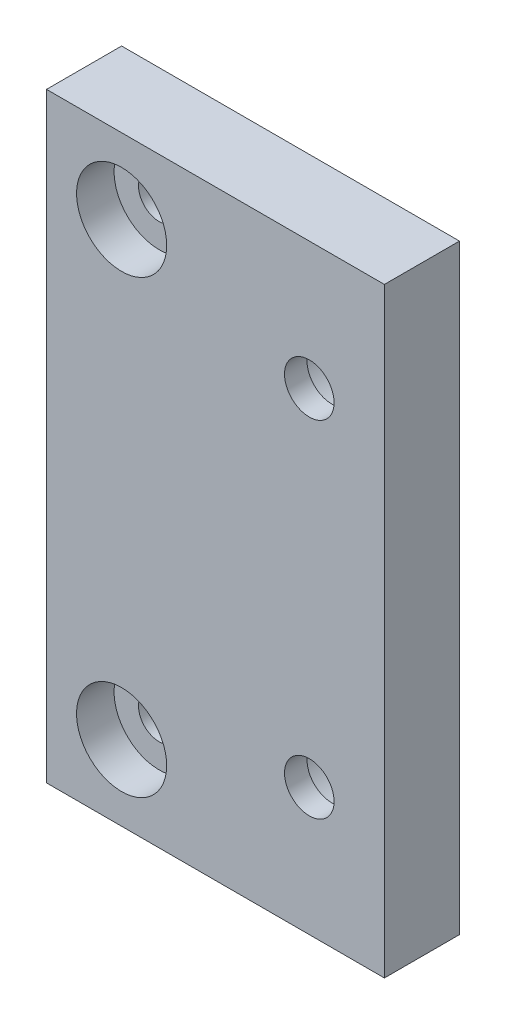
ISO-10303-21;
HEADER;
FILE_DESCRIPTION(('STEP AP214'),'2;1');
FILE_NAME('part.step','',(''),(''),'','','');
FILE_SCHEMA(('AUTOMOTIVE_DESIGN { 1 0 10303 214 1 1 1 1 }'));
ENDSEC;
DATA;
#1=APPLICATION_CONTEXT('core data for automotive mechanical design processes');
#2=APPLICATION_PROTOCOL_DEFINITION('international standard','automotive_design',2000,#1);
#3=PRODUCT_CONTEXT('',#1,'mechanical');
#4=PRODUCT('Part','Part','',(#3));
#5=PRODUCT_RELATED_PRODUCT_CATEGORY('part','',(#4));
#6=PRODUCT_DEFINITION_FORMATION('','',#4);
#7=PRODUCT_DEFINITION_CONTEXT('part definition',#1,'design');
#8=PRODUCT_DEFINITION('design','',#6,#7);
#9=PRODUCT_DEFINITION_SHAPE('','',#8);
#10=(LENGTH_UNIT() NAMED_UNIT(*) SI_UNIT(.MILLI.,.METRE.));
#11=(NAMED_UNIT(*) PLANE_ANGLE_UNIT() SI_UNIT($,.RADIAN.));
#12=(NAMED_UNIT(*) SI_UNIT($,.STERADIAN.) SOLID_ANGLE_UNIT());
#13=UNCERTAINTY_MEASURE_WITH_UNIT(LENGTH_MEASURE(1.E-05),#10,'distance_accuracy_value','');
#14=(GEOMETRIC_REPRESENTATION_CONTEXT(3) GLOBAL_UNCERTAINTY_ASSIGNED_CONTEXT((#13)) GLOBAL_UNIT_ASSIGNED_CONTEXT((#10,
#11,#12)) REPRESENTATION_CONTEXT('',''));
#15=CARTESIAN_POINT('',(0.,0.,0.));
#16=DIRECTION('',(0.,0.,1.));
#17=DIRECTION('',(1.,0.,0.));
#18=AXIS2_PLACEMENT_3D('',#15,#16,#17);
#19=CARTESIAN_POINT('',(-1.17813610582342,24.1380472116371,10.));
#20=DIRECTION('',(0.,0.,-1.));
#21=DIRECTION('',(-1.,0.,0.));
#22=AXIS2_PLACEMENT_3D('',#19,#20,#21);
#23=CYLINDRICAL_SURFACE('',#22,3.3);
#24=CARTESIAN_POINT('',(-1.17813610582342,24.1380472116371,10.));
#25=DIRECTION('',(0.,0.,1.));
#26=DIRECTION('',(1.,0.,0.));
#27=AXIS2_PLACEMENT_3D('',#24,#25,#26);
#28=CIRCLE('',#27,3.3);
#29=CARTESIAN_POINT('',(2.12186389417658,24.1380472116371,10.));
#30=VERTEX_POINT('',#29);
#31=EDGE_CURVE('E118',#30,#30,#28,.T.);
#32=ORIENTED_EDGE('',*,*,#31,.T.);
#33=EDGE_LOOP('',(#32));
#34=FACE_BOUND('',#33,.T.);
#35=CARTESIAN_POINT('',(-1.17813610582342,24.1380472116371,7.));
#36=DIRECTION('',(0.,0.,-1.));
#37=DIRECTION('',(-1.,0.,0.));
#38=AXIS2_PLACEMENT_3D('',#35,#36,#37);
#39=CIRCLE('',#38,3.3);
#40=CARTESIAN_POINT('',(-4.47813610582342,24.1380472116371,7.));
#41=VERTEX_POINT('',#40);
#42=EDGE_CURVE('E45',#41,#41,#39,.T.);
#43=ORIENTED_EDGE('',*,*,#42,.T.);
#44=EDGE_LOOP('',(#43));
#45=FACE_BOUND('',#44,.T.);
#46=ADVANCED_FACE('F41',(#34,#45),#23,.F.);
#47=CARTESIAN_POINT('',(-1.17813610582342,-21.8619527883629,10.));
#48=DIRECTION('',(0.,0.,-1.));
#49=DIRECTION('',(-1.,0.,0.));
#50=AXIS2_PLACEMENT_3D('',#47,#48,#49);
#51=CYLINDRICAL_SURFACE('',#50,3.3);
#52=CARTESIAN_POINT('',(-1.17813610582342,-21.8619527883629,10.));
#53=DIRECTION('',(0.,0.,1.));
#54=DIRECTION('',(1.,0.,0.));
#55=AXIS2_PLACEMENT_3D('',#52,#53,#54);
#56=CIRCLE('',#55,3.3);
#57=CARTESIAN_POINT('',(2.12186389417658,-21.8619527883629,10.));
#58=VERTEX_POINT('',#57);
#59=EDGE_CURVE('E186',#58,#58,#56,.T.);
#60=ORIENTED_EDGE('',*,*,#59,.T.);
#61=EDGE_LOOP('',(#60));
#62=FACE_BOUND('',#61,.T.);
#63=CARTESIAN_POINT('',(-1.17813610582342,-21.8619527883629,7.));
#64=DIRECTION('',(0.,0.,-1.));
#65=DIRECTION('',(-1.,0.,0.));
#66=AXIS2_PLACEMENT_3D('',#63,#64,#65);
#67=CIRCLE('',#66,3.3);
#68=CARTESIAN_POINT('',(-4.47813610582342,-21.8619527883629,7.));
#69=VERTEX_POINT('',#68);
#70=EDGE_CURVE('E138',#69,#69,#67,.T.);
#71=ORIENTED_EDGE('',*,*,#70,.T.);
#72=EDGE_LOOP('',(#71));
#73=FACE_BOUND('',#72,.T.);
#74=ADVANCED_FACE('F215',(#62,#73),#51,.F.);
#75=CARTESIAN_POINT('',(-26.1781361058234,31.1380472116371,10.));
#76=DIRECTION('',(0.,0.,-1.));
#77=DIRECTION('',(-1.,0.,0.));
#78=AXIS2_PLACEMENT_3D('',#75,#76,#77);
#79=CYLINDRICAL_SURFACE('',#78,2.75);
#80=CARTESIAN_POINT('',(-26.1781361058234,31.1380472116371,0.));
#81=DIRECTION('',(0.,0.,1.));
#82=DIRECTION('',(1.,0.,0.));
#83=AXIS2_PLACEMENT_3D('',#80,#81,#82);
#84=CIRCLE('',#83,2.75);
#85=CARTESIAN_POINT('',(-23.4281361058234,31.1380472116371,0.));
#86=VERTEX_POINT('',#85);
#87=EDGE_CURVE('E182',#86,#86,#84,.T.);
#88=ORIENTED_EDGE('',*,*,#87,.F.);
#89=EDGE_LOOP('',(#88));
#90=FACE_BOUND('',#89,.T.);
#91=CARTESIAN_POINT('',(-26.1781361058234,31.1380472116371,5.));
#92=DIRECTION('',(0.,0.,1.));
#93=DIRECTION('',(1.,0.,0.));
#94=AXIS2_PLACEMENT_3D('',#91,#92,#93);
#95=CIRCLE('',#94,2.75);
#96=CARTESIAN_POINT('',(-23.4281361058234,31.1380472116371,5.));
#97=VERTEX_POINT('',#96);
#98=EDGE_CURVE('E133',#97,#97,#95,.T.);
#99=ORIENTED_EDGE('',*,*,#98,.T.);
#100=EDGE_LOOP('',(#99));
#101=FACE_BOUND('',#100,.T.);
#102=ADVANCED_FACE('F208',(#90,#101),#79,.F.);
#103=CARTESIAN_POINT('',(-26.1781361058234,-28.8619527883629,10.));
#104=DIRECTION('',(0.,0.,-1.));
#105=DIRECTION('',(-1.,0.,0.));
#106=AXIS2_PLACEMENT_3D('',#103,#104,#105);
#107=CYLINDRICAL_SURFACE('',#106,2.75);
#108=CARTESIAN_POINT('',(-26.1781361058234,-28.8619527883629,0.));
#109=DIRECTION('',(0.,0.,1.));
#110=DIRECTION('',(1.,0.,0.));
#111=AXIS2_PLACEMENT_3D('',#108,#109,#110);
#112=CIRCLE('',#111,2.75);
#113=CARTESIAN_POINT('',(-23.4281361058234,-28.8619527883629,0.));
#114=VERTEX_POINT('',#113);
#115=EDGE_CURVE('E137',#114,#114,#112,.T.);
#116=ORIENTED_EDGE('',*,*,#115,.F.);
#117=EDGE_LOOP('',(#116));
#118=FACE_BOUND('',#117,.T.);
#119=CARTESIAN_POINT('',(-26.1781361058234,-28.8619527883629,5.));
#120=DIRECTION('',(0.,0.,1.));
#121=DIRECTION('',(1.,0.,0.));
#122=AXIS2_PLACEMENT_3D('',#119,#120,#121);
#123=CIRCLE('',#122,2.75);
#124=CARTESIAN_POINT('',(-23.4281361058234,-28.8619527883629,5.));
#125=VERTEX_POINT('',#124);
#126=EDGE_CURVE('E129',#125,#125,#123,.T.);
#127=ORIENTED_EDGE('',*,*,#126,.T.);
#128=EDGE_LOOP('',(#127));
#129=FACE_BOUND('',#128,.T.);
#130=ADVANCED_FACE('F199',(#118,#129),#107,.F.);
#131=CARTESIAN_POINT('',(0.,0.,10.));
#132=DIRECTION('',(0.,0.,1.));
#133=DIRECTION('',(1.,0.,0.));
#134=AXIS2_PLACEMENT_3D('',#131,#132,#133);
#135=PLANE('',#134);
#136=CARTESIAN_POINT('',(-26.1781361058234,31.1380472116371,10.));
#137=DIRECTION('',(0.,0.,1.));
#138=DIRECTION('',(1.,0.,0.));
#139=AXIS2_PLACEMENT_3D('',#136,#137,#138);
#140=CIRCLE('',#139,6.);
#141=CARTESIAN_POINT('',(-20.1781361058234,31.1380472116371,10.));
#142=VERTEX_POINT('',#141);
#143=EDGE_CURVE('E168',#142,#142,#140,.T.);
#144=ORIENTED_EDGE('',*,*,#143,.F.);
#145=EDGE_LOOP('',(#144));
#146=FACE_BOUND('',#145,.T.);
#147=CARTESIAN_POINT('',(-26.1781361058234,-28.8619527883629,10.));
#148=DIRECTION('',(0.,0.,1.));
#149=DIRECTION('',(1.,0.,0.));
#150=AXIS2_PLACEMENT_3D('',#147,#148,#149);
#151=CIRCLE('',#150,6.);
#152=CARTESIAN_POINT('',(-20.1781361058234,-28.8619527883629,10.));
#153=VERTEX_POINT('',#152);
#154=EDGE_CURVE('E147',#153,#153,#151,.T.);
#155=ORIENTED_EDGE('',*,*,#154,.F.);
#156=EDGE_LOOP('',(#155));
#157=FACE_BOUND('',#156,.T.);
#158=ORIENTED_EDGE('',*,*,#31,.F.);
#159=EDGE_LOOP('',(#158));
#160=FACE_BOUND('',#159,.T.);
#161=DIRECTION('',(0.,-1.,0.));
#162=VECTOR('',#161,1.);
#163=CARTESIAN_POINT('',(-36.1781361058234,41.1380472116371,10.));
#164=LINE('',#163,#162);
#165=CARTESIAN_POINT('',(-36.1781361058234,41.1380472116371,10.));
#166=VERTEX_POINT('',#165);
#167=CARTESIAN_POINT('',(-36.1781361058234,-38.8619527883629,10.));
#168=VERTEX_POINT('',#167);
#169=EDGE_CURVE('E97',#166,#168,#164,.T.);
#170=ORIENTED_EDGE('',*,*,#169,.T.);
#171=DIRECTION('',(1.,0.,0.));
#172=VECTOR('',#171,1.);
#173=CARTESIAN_POINT('',(-36.1781361058234,-38.8619527883629,10.));
#174=LINE('',#173,#172);
#175=CARTESIAN_POINT('',(8.82186389417659,-38.8619527883629,10.));
#176=VERTEX_POINT('',#175);
#177=EDGE_CURVE('E91',#168,#176,#174,.T.);
#178=ORIENTED_EDGE('',*,*,#177,.T.);
#179=DIRECTION('',(0.,1.,0.));
#180=VECTOR('',#179,1.);
#181=CARTESIAN_POINT('',(8.82186389417659,41.1380472116371,10.));
#182=LINE('',#181,#180);
#183=CARTESIAN_POINT('',(8.82186389417659,41.1380472116371,10.));
#184=VERTEX_POINT('',#183);
#185=EDGE_CURVE('E95',#176,#184,#182,.T.);
#186=ORIENTED_EDGE('',*,*,#185,.T.);
#187=DIRECTION('',(-1.,0.,0.));
#188=VECTOR('',#187,1.);
#189=CARTESIAN_POINT('',(-36.1781361058234,41.1380472116371,10.));
#190=LINE('',#189,#188);
#191=EDGE_CURVE('E61',#184,#166,#190,.T.);
#192=ORIENTED_EDGE('',*,*,#191,.T.);
#193=EDGE_LOOP('',(#170,#178,#186,#192));
#194=FACE_BOUND('',#193,.T.);
#195=ORIENTED_EDGE('',*,*,#59,.F.);
#196=EDGE_LOOP('',(#195));
#197=FACE_BOUND('',#196,.T.);
#198=ADVANCED_FACE('F92',(#146,#157,#160,#194,#197),#135,.T.);
#199=CARTESIAN_POINT('',(0.,0.,0.));
#200=DIRECTION('',(0.,0.,1.));
#201=DIRECTION('',(1.,0.,0.));
#202=AXIS2_PLACEMENT_3D('',#199,#200,#201);
#203=PLANE('',#202);
#204=CARTESIAN_POINT('',(-1.17813610582342,24.1380472116371,0.));
#205=DIRECTION('',(0.,0.,-1.));
#206=DIRECTION('',(-1.,0.,0.));
#207=AXIS2_PLACEMENT_3D('',#204,#205,#206);
#208=CIRCLE('',#207,7.);
#209=CARTESIAN_POINT('',(-8.17813610582342,24.1380472116371,0.));
#210=VERTEX_POINT('',#209);
#211=EDGE_CURVE('E149',#210,#210,#208,.T.);
#212=ORIENTED_EDGE('',*,*,#211,.F.);
#213=EDGE_LOOP('',(#212));
#214=FACE_BOUND('',#213,.T.);
#215=CARTESIAN_POINT('',(-1.17813610582342,-21.8619527883629,0.));
#216=DIRECTION('',(0.,0.,-1.));
#217=DIRECTION('',(-1.,0.,0.));
#218=AXIS2_PLACEMENT_3D('',#215,#216,#217);
#219=CIRCLE('',#218,7.);
#220=CARTESIAN_POINT('',(-8.17813610582342,-21.8619527883629,0.));
#221=VERTEX_POINT('',#220);
#222=EDGE_CURVE('E161',#221,#221,#219,.T.);
#223=ORIENTED_EDGE('',*,*,#222,.F.);
#224=EDGE_LOOP('',(#223));
#225=FACE_BOUND('',#224,.T.);
#226=DIRECTION('',(0.,-1.,0.));
#227=VECTOR('',#226,1.);
#228=CARTESIAN_POINT('',(-36.1781361058234,41.1380472116371,0.));
#229=LINE('',#228,#227);
#230=CARTESIAN_POINT('',(-36.1781361058234,41.1380472116371,0.));
#231=VERTEX_POINT('',#230);
#232=CARTESIAN_POINT('',(-36.1781361058234,-38.8619527883629,0.));
#233=VERTEX_POINT('',#232);
#234=EDGE_CURVE('E114',#231,#233,#229,.T.);
#235=ORIENTED_EDGE('',*,*,#234,.F.);
#236=DIRECTION('',(-1.,0.,0.));
#237=VECTOR('',#236,1.);
#238=CARTESIAN_POINT('',(-36.1781361058234,41.1380472116371,0.));
#239=LINE('',#238,#237);
#240=CARTESIAN_POINT('',(8.82186389417659,41.1380472116371,0.));
#241=VERTEX_POINT('',#240);
#242=EDGE_CURVE('E84',#241,#231,#239,.T.);
#243=ORIENTED_EDGE('',*,*,#242,.F.);
#244=DIRECTION('',(0.,1.,0.));
#245=VECTOR('',#244,1.);
#246=CARTESIAN_POINT('',(8.82186389417659,41.1380472116371,0.));
#247=LINE('',#246,#245);
#248=CARTESIAN_POINT('',(8.82186389417659,-38.8619527883629,0.));
#249=VERTEX_POINT('',#248);
#250=EDGE_CURVE('E78',#249,#241,#247,.T.);
#251=ORIENTED_EDGE('',*,*,#250,.F.);
#252=DIRECTION('',(1.,0.,0.));
#253=VECTOR('',#252,1.);
#254=CARTESIAN_POINT('',(-36.1781361058234,-38.8619527883629,0.));
#255=LINE('',#254,#253);
#256=EDGE_CURVE('E102',#233,#249,#255,.T.);
#257=ORIENTED_EDGE('',*,*,#256,.F.);
#258=EDGE_LOOP('',(#235,#243,#251,#257));
#259=FACE_BOUND('',#258,.T.);
#260=ORIENTED_EDGE('',*,*,#87,.T.);
#261=EDGE_LOOP('',(#260));
#262=FACE_BOUND('',#261,.T.);
#263=ORIENTED_EDGE('',*,*,#115,.T.);
#264=EDGE_LOOP('',(#263));
#265=FACE_BOUND('',#264,.T.);
#266=ADVANCED_FACE('F198',(#214,#225,#259,#262,#265),#203,.F.);
#267=CARTESIAN_POINT('',(-36.1781361058234,41.1380472116371,10.));
#268=DIRECTION('',(1.,0.,0.));
#269=DIRECTION('',(0.,0.,-1.));
#270=AXIS2_PLACEMENT_3D('',#267,#268,#269);
#271=PLANE('',#270);
#272=ORIENTED_EDGE('',*,*,#234,.T.);
#273=DIRECTION('',(0.,0.,-1.));
#274=VECTOR('',#273,1.);
#275=CARTESIAN_POINT('',(-36.1781361058234,-38.8619527883629,10.));
#276=LINE('',#275,#274);
#277=EDGE_CURVE('E11',#168,#233,#276,.T.);
#278=ORIENTED_EDGE('',*,*,#277,.F.);
#279=ORIENTED_EDGE('',*,*,#169,.F.);
#280=DIRECTION('',(0.,0.,-1.));
#281=VECTOR('',#280,1.);
#282=CARTESIAN_POINT('',(-36.1781361058234,41.1380472116371,10.));
#283=LINE('',#282,#281);
#284=EDGE_CURVE('E110',#166,#231,#283,.T.);
#285=ORIENTED_EDGE('',*,*,#284,.T.);
#286=EDGE_LOOP('',(#272,#278,#279,#285));
#287=FACE_BOUND('',#286,.T.);
#288=ADVANCED_FACE('F43',(#287),#271,.F.);
#289=CARTESIAN_POINT('',(-36.1781361058234,-38.8619527883629,10.));
#290=DIRECTION('',(0.,1.,0.));
#291=DIRECTION('',(0.,0.,1.));
#292=AXIS2_PLACEMENT_3D('',#289,#290,#291);
#293=PLANE('',#292);
#294=ORIENTED_EDGE('',*,*,#256,.T.);
#295=DIRECTION('',(0.,0.,-1.));
#296=VECTOR('',#295,1.);
#297=CARTESIAN_POINT('',(8.82186389417659,-38.8619527883629,10.));
#298=LINE('',#297,#296);
#299=EDGE_CURVE('E52',#176,#249,#298,.T.);
#300=ORIENTED_EDGE('',*,*,#299,.F.);
#301=ORIENTED_EDGE('',*,*,#177,.F.);
#302=ORIENTED_EDGE('',*,*,#277,.T.);
#303=EDGE_LOOP('',(#294,#300,#301,#302));
#304=FACE_BOUND('',#303,.T.);
#305=ADVANCED_FACE('F101',(#304),#293,.F.);
#306=CARTESIAN_POINT('',(8.82186389417659,41.1380472116371,10.));
#307=DIRECTION('',(-1.,0.,0.));
#308=DIRECTION('',(0.,0.,1.));
#309=AXIS2_PLACEMENT_3D('',#306,#307,#308);
#310=PLANE('',#309);
#311=ORIENTED_EDGE('',*,*,#250,.T.);
#312=DIRECTION('',(0.,0.,-1.));
#313=VECTOR('',#312,1.);
#314=CARTESIAN_POINT('',(8.82186389417659,41.1380472116371,10.));
#315=LINE('',#314,#313);
#316=EDGE_CURVE('E104',#184,#241,#315,.T.);
#317=ORIENTED_EDGE('',*,*,#316,.F.);
#318=ORIENTED_EDGE('',*,*,#185,.F.);
#319=ORIENTED_EDGE('',*,*,#299,.T.);
#320=EDGE_LOOP('',(#311,#317,#318,#319));
#321=FACE_BOUND('',#320,.T.);
#322=ADVANCED_FACE('F106',(#321),#310,.F.);
#323=CARTESIAN_POINT('',(-36.1781361058234,41.1380472116371,10.));
#324=DIRECTION('',(0.,-1.,0.));
#325=DIRECTION('',(0.,0.,-1.));
#326=AXIS2_PLACEMENT_3D('',#323,#324,#325);
#327=PLANE('',#326);
#328=ORIENTED_EDGE('',*,*,#242,.T.);
#329=ORIENTED_EDGE('',*,*,#284,.F.);
#330=ORIENTED_EDGE('',*,*,#191,.F.);
#331=ORIENTED_EDGE('',*,*,#316,.T.);
#332=EDGE_LOOP('',(#328,#329,#330,#331));
#333=FACE_BOUND('',#332,.T.);
#334=ADVANCED_FACE('F229',(#333),#327,.F.);
#335=CARTESIAN_POINT('',(-26.1781361058234,-28.8619527883629,5.));
#336=DIRECTION('',(0.,0.,1.));
#337=DIRECTION('',(1.,0.,0.));
#338=AXIS2_PLACEMENT_3D('',#335,#336,#337);
#339=CYLINDRICAL_SURFACE('',#338,6.);
#340=CARTESIAN_POINT('',(-26.1781361058234,-28.8619527883629,5.));
#341=DIRECTION('',(0.,0.,1.));
#342=DIRECTION('',(1.,0.,0.));
#343=AXIS2_PLACEMENT_3D('',#340,#341,#342);
#344=CIRCLE('',#343,6.);
#345=CARTESIAN_POINT('',(-20.1781361058234,-28.8619527883629,5.));
#346=VERTEX_POINT('',#345);
#347=EDGE_CURVE('E172',#346,#346,#344,.T.);
#348=ORIENTED_EDGE('',*,*,#347,.F.);
#349=EDGE_LOOP('',(#348));
#350=FACE_BOUND('',#349,.T.);
#351=ORIENTED_EDGE('',*,*,#154,.T.);
#352=EDGE_LOOP('',(#351));
#353=FACE_BOUND('',#352,.T.);
#354=ADVANCED_FACE('F225',(#350,#353),#339,.F.);
#355=CARTESIAN_POINT('',(-26.1781361058234,-28.8619527883629,5.));
#356=DIRECTION('',(0.,0.,1.));
#357=DIRECTION('',(1.,0.,0.));
#358=AXIS2_PLACEMENT_3D('',#355,#356,#357);
#359=PLANE('',#358);
#360=ORIENTED_EDGE('',*,*,#126,.F.);
#361=EDGE_LOOP('',(#360));
#362=FACE_BOUND('',#361,.T.);
#363=ORIENTED_EDGE('',*,*,#347,.T.);
#364=EDGE_LOOP('',(#363));
#365=FACE_BOUND('',#364,.T.);
#366=ADVANCED_FACE('F228',(#362,#365),#359,.T.);
#367=CARTESIAN_POINT('',(-26.1781361058234,31.1380472116371,5.));
#368=DIRECTION('',(0.,0.,1.));
#369=DIRECTION('',(1.,0.,0.));
#370=AXIS2_PLACEMENT_3D('',#367,#368,#369);
#371=CYLINDRICAL_SURFACE('',#370,6.);
#372=CARTESIAN_POINT('',(-26.1781361058234,31.1380472116371,5.));
#373=DIRECTION('',(0.,0.,1.));
#374=DIRECTION('',(1.,0.,0.));
#375=AXIS2_PLACEMENT_3D('',#372,#373,#374);
#376=CIRCLE('',#375,6.);
#377=CARTESIAN_POINT('',(-20.1781361058234,31.1380472116371,5.));
#378=VERTEX_POINT('',#377);
#379=EDGE_CURVE('E134',#378,#378,#376,.T.);
#380=ORIENTED_EDGE('',*,*,#379,.F.);
#381=EDGE_LOOP('',(#380));
#382=FACE_BOUND('',#381,.T.);
#383=ORIENTED_EDGE('',*,*,#143,.T.);
#384=EDGE_LOOP('',(#383));
#385=FACE_BOUND('',#384,.T.);
#386=ADVANCED_FACE('F233',(#382,#385),#371,.F.);
#387=CARTESIAN_POINT('',(-26.1781361058234,31.1380472116371,5.));
#388=DIRECTION('',(0.,0.,1.));
#389=DIRECTION('',(1.,0.,0.));
#390=AXIS2_PLACEMENT_3D('',#387,#388,#389);
#391=PLANE('',#390);
#392=ORIENTED_EDGE('',*,*,#98,.F.);
#393=EDGE_LOOP('',(#392));
#394=FACE_BOUND('',#393,.T.);
#395=ORIENTED_EDGE('',*,*,#379,.T.);
#396=EDGE_LOOP('',(#395));
#397=FACE_BOUND('',#396,.T.);
#398=ADVANCED_FACE('F237',(#394,#397),#391,.T.);
#399=CARTESIAN_POINT('',(-1.17813610582342,-21.8619527883629,7.));
#400=DIRECTION('',(0.,0.,-1.));
#401=DIRECTION('',(-1.,0.,0.));
#402=AXIS2_PLACEMENT_3D('',#399,#400,#401);
#403=CYLINDRICAL_SURFACE('',#402,7.);
#404=CARTESIAN_POINT('',(-1.17813610582342,-21.8619527883629,7.));
#405=DIRECTION('',(0.,0.,-1.));
#406=DIRECTION('',(-1.,0.,0.));
#407=AXIS2_PLACEMENT_3D('',#404,#405,#406);
#408=CIRCLE('',#407,7.);
#409=CARTESIAN_POINT('',(-8.17813610582342,-21.8619527883629,7.));
#410=VERTEX_POINT('',#409);
#411=EDGE_CURVE('E155',#410,#410,#408,.T.);
#412=ORIENTED_EDGE('',*,*,#411,.F.);
#413=EDGE_LOOP('',(#412));
#414=FACE_BOUND('',#413,.T.);
#415=ORIENTED_EDGE('',*,*,#222,.T.);
#416=EDGE_LOOP('',(#415));
#417=FACE_BOUND('',#416,.T.);
#418=ADVANCED_FACE('F241',(#414,#417),#403,.F.);
#419=CARTESIAN_POINT('',(-1.17813610582342,-21.8619527883629,7.));
#420=DIRECTION('',(0.,0.,-1.));
#421=DIRECTION('',(-1.,0.,0.));
#422=AXIS2_PLACEMENT_3D('',#419,#420,#421);
#423=PLANE('',#422);
#424=ORIENTED_EDGE('',*,*,#70,.F.);
#425=EDGE_LOOP('',(#424));
#426=FACE_BOUND('',#425,.T.);
#427=ORIENTED_EDGE('',*,*,#411,.T.);
#428=EDGE_LOOP('',(#427));
#429=FACE_BOUND('',#428,.T.);
#430=ADVANCED_FACE('F245',(#426,#429),#423,.T.);
#431=CARTESIAN_POINT('',(-1.17813610582342,24.1380472116371,7.));
#432=DIRECTION('',(0.,0.,-1.));
#433=DIRECTION('',(-1.,0.,0.));
#434=AXIS2_PLACEMENT_3D('',#431,#432,#433);
#435=CYLINDRICAL_SURFACE('',#434,7.);
#436=CARTESIAN_POINT('',(-1.17813610582342,24.1380472116371,7.));
#437=DIRECTION('',(0.,0.,-1.));
#438=DIRECTION('',(-1.,0.,0.));
#439=AXIS2_PLACEMENT_3D('',#436,#437,#438);
#440=CIRCLE('',#439,7.);
#441=CARTESIAN_POINT('',(-8.17813610582342,24.1380472116371,7.));
#442=VERTEX_POINT('',#441);
#443=EDGE_CURVE('E141',#442,#442,#440,.T.);
#444=ORIENTED_EDGE('',*,*,#443,.F.);
#445=EDGE_LOOP('',(#444));
#446=FACE_BOUND('',#445,.T.);
#447=ORIENTED_EDGE('',*,*,#211,.T.);
#448=EDGE_LOOP('',(#447));
#449=FACE_BOUND('',#448,.T.);
#450=ADVANCED_FACE('F249',(#446,#449),#435,.F.);
#451=CARTESIAN_POINT('',(-1.17813610582342,24.1380472116371,7.));
#452=DIRECTION('',(0.,0.,-1.));
#453=DIRECTION('',(-1.,0.,0.));
#454=AXIS2_PLACEMENT_3D('',#451,#452,#453);
#455=PLANE('',#454);
#456=ORIENTED_EDGE('',*,*,#42,.F.);
#457=EDGE_LOOP('',(#456));
#458=FACE_BOUND('',#457,.T.);
#459=ORIENTED_EDGE('',*,*,#443,.T.);
#460=EDGE_LOOP('',(#459));
#461=FACE_BOUND('',#460,.T.);
#462=ADVANCED_FACE('F253',(#458,#461),#455,.T.);
#463=CLOSED_SHELL('',(#46,#74,#102,#130,#198,#266,#288,#305,#322,#334,#354,#366,#386,#398,#418,
#430,#450,#462));
#464=MANIFOLD_SOLID_BREP('B2',#463);
#465=ADVANCED_BREP_SHAPE_REPRESENTATION('',(#18,#464),#14);
#466=SHAPE_DEFINITION_REPRESENTATION(#9,#465);
ENDSEC;
END-ISO-10303-21;
